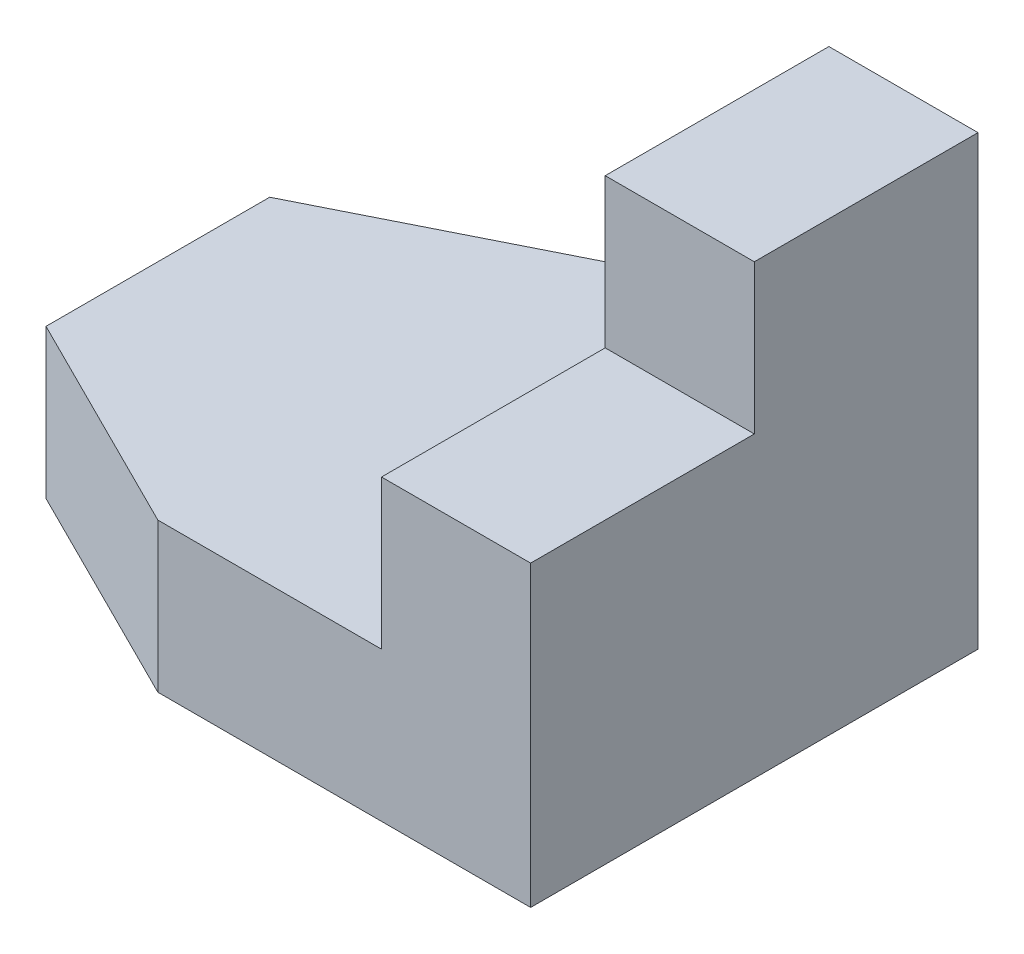
ISO-10303-21;
HEADER;
FILE_DESCRIPTION(('STEP AP214'),'2;1');
FILE_NAME('part.step','',(''),(''),'','','');
FILE_SCHEMA(('AUTOMOTIVE_DESIGN { 1 0 10303 214 1 1 1 1 }'));
ENDSEC;
DATA;
#1=APPLICATION_CONTEXT('core data for automotive mechanical design processes');
#2=APPLICATION_PROTOCOL_DEFINITION('international standard','automotive_design',2000,#1);
#3=PRODUCT_CONTEXT('',#1,'mechanical');
#4=PRODUCT('Part','Part','',(#3));
#5=PRODUCT_RELATED_PRODUCT_CATEGORY('part','',(#4));
#6=PRODUCT_DEFINITION_FORMATION('','',#4);
#7=PRODUCT_DEFINITION_CONTEXT('part definition',#1,'design');
#8=PRODUCT_DEFINITION('design','',#6,#7);
#9=PRODUCT_DEFINITION_SHAPE('','',#8);
#10=(LENGTH_UNIT() NAMED_UNIT(*) SI_UNIT(.MILLI.,.METRE.));
#11=(NAMED_UNIT(*) PLANE_ANGLE_UNIT() SI_UNIT($,.RADIAN.));
#12=(NAMED_UNIT(*) SI_UNIT($,.STERADIAN.) SOLID_ANGLE_UNIT());
#13=UNCERTAINTY_MEASURE_WITH_UNIT(LENGTH_MEASURE(1.E-05),#10,'distance_accuracy_value','');
#14=(GEOMETRIC_REPRESENTATION_CONTEXT(3) GLOBAL_UNCERTAINTY_ASSIGNED_CONTEXT((#13)) GLOBAL_UNIT_ASSIGNED_CONTEXT((#10,
#11,#12)) REPRESENTATION_CONTEXT('',''));
#15=CARTESIAN_POINT('',(0.,0.,0.));
#16=DIRECTION('',(0.,0.,1.));
#17=DIRECTION('',(1.,0.,0.));
#18=AXIS2_PLACEMENT_3D('',#15,#16,#17);
#19=CARTESIAN_POINT('',(-40.,0.,15.));
#20=DIRECTION('',(0.,1.,0.));
#21=DIRECTION('',(0.,0.,1.));
#22=AXIS2_PLACEMENT_3D('',#19,#20,#21);
#23=PLANE('',#22);
#24=DIRECTION('',(0.894427190999916,0.,-0.447213595499958));
#25=VECTOR('',#24,1.);
#26=CARTESIAN_POINT('',(-25.,0.,-15.));
#27=LINE('',#26,#25);
#28=CARTESIAN_POINT('',(-40.,0.,-7.5));
#29=VERTEX_POINT('',#28);
#30=CARTESIAN_POINT('',(-25.,0.,-15.));
#31=VERTEX_POINT('',#30);
#32=EDGE_CURVE('E158',#29,#31,#27,.T.);
#33=ORIENTED_EDGE('',*,*,#32,.T.);
#34=DIRECTION('',(1.,0.,0.));
#35=VECTOR('',#34,1.);
#36=CARTESIAN_POINT('',(-40.,0.,-15.));
#37=LINE('',#36,#35);
#38=CARTESIAN_POINT('',(0.,0.,-15.));
#39=VERTEX_POINT('',#38);
#40=EDGE_CURVE('E156',#31,#39,#37,.T.);
#41=ORIENTED_EDGE('',*,*,#40,.T.);
#42=DIRECTION('',(0.,0.,-1.));
#43=VECTOR('',#42,1.);
#44=CARTESIAN_POINT('',(0.,0.,15.));
#45=LINE('',#44,#43);
#46=CARTESIAN_POINT('',(0.,0.,15.));
#47=VERTEX_POINT('',#46);
#48=EDGE_CURVE('E11',#47,#39,#45,.T.);
#49=ORIENTED_EDGE('',*,*,#48,.F.);
#50=DIRECTION('',(1.,0.,0.));
#51=VECTOR('',#50,1.);
#52=CARTESIAN_POINT('',(-40.,0.,15.));
#53=LINE('',#52,#51);
#54=CARTESIAN_POINT('',(-25.,0.,15.));
#55=VERTEX_POINT('',#54);
#56=EDGE_CURVE('E180',#55,#47,#53,.T.);
#57=ORIENTED_EDGE('',*,*,#56,.F.);
#58=DIRECTION('',(-0.894427190999916,0.,-0.447213595499958));
#59=VECTOR('',#58,1.);
#60=CARTESIAN_POINT('',(-25.,0.,15.));
#61=LINE('',#60,#59);
#62=CARTESIAN_POINT('',(-40.,0.,7.5));
#63=VERTEX_POINT('',#62);
#64=EDGE_CURVE('E68',#55,#63,#61,.T.);
#65=ORIENTED_EDGE('',*,*,#64,.T.);
#66=DIRECTION('',(0.,0.,-1.));
#67=VECTOR('',#66,1.);
#68=CARTESIAN_POINT('',(-40.,0.,15.));
#69=LINE('',#68,#67);
#70=EDGE_CURVE('E194',#63,#29,#69,.T.);
#71=ORIENTED_EDGE('',*,*,#70,.T.);
#72=EDGE_LOOP('',(#33,#41,#49,#57,#65,#71));
#73=FACE_BOUND('',#72,.T.);
#74=ADVANCED_FACE('F45',(#73),#23,.F.);
#75=CARTESIAN_POINT('',(-10.,10.,15.));
#76=DIRECTION('',(0.,-1.,0.));
#77=DIRECTION('',(1.,0.,0.));
#78=AXIS2_PLACEMENT_3D('',#75,#76,#77);
#79=PLANE('',#78);
#80=DIRECTION('',(-0.894427190999916,0.,0.447213595499958));
#81=VECTOR('',#80,1.);
#82=CARTESIAN_POINT('',(-25.,10.,-15.));
#83=LINE('',#82,#81);
#84=CARTESIAN_POINT('',(-25.,10.,-15.));
#85=VERTEX_POINT('',#84);
#86=CARTESIAN_POINT('',(-40.,10.,-7.5));
#87=VERTEX_POINT('',#86);
#88=EDGE_CURVE('E152',#85,#87,#83,.T.);
#89=ORIENTED_EDGE('',*,*,#88,.T.);
#90=DIRECTION('',(0.,0.,-1.));
#91=VECTOR('',#90,1.);
#92=CARTESIAN_POINT('',(-40.,10.,15.));
#93=LINE('',#92,#91);
#94=CARTESIAN_POINT('',(-40.,10.,7.5));
#95=VERTEX_POINT('',#94);
#96=EDGE_CURVE('E214',#95,#87,#93,.T.);
#97=ORIENTED_EDGE('',*,*,#96,.F.);
#98=DIRECTION('',(0.894427190999916,0.,0.447213595499958));
#99=VECTOR('',#98,1.);
#100=CARTESIAN_POINT('',(-25.,10.,15.));
#101=LINE('',#100,#99);
#102=CARTESIAN_POINT('',(-25.,10.,15.));
#103=VERTEX_POINT('',#102);
#104=EDGE_CURVE('E172',#95,#103,#101,.T.);
#105=ORIENTED_EDGE('',*,*,#104,.T.);
#106=DIRECTION('',(-1.,0.,0.));
#107=VECTOR('',#106,1.);
#108=CARTESIAN_POINT('',(-10.,10.,15.));
#109=LINE('',#108,#107);
#110=CARTESIAN_POINT('',(-10.,10.,15.));
#111=VERTEX_POINT('',#110);
#112=EDGE_CURVE('E190',#111,#103,#109,.T.);
#113=ORIENTED_EDGE('',*,*,#112,.F.);
#114=DIRECTION('',(0.,0.,-1.));
#115=VECTOR('',#114,1.);
#116=CARTESIAN_POINT('',(-10.,10.,15.));
#117=LINE('',#116,#115);
#118=CARTESIAN_POINT('',(-10.,10.,-15.));
#119=VERTEX_POINT('',#118);
#120=EDGE_CURVE('E218',#111,#119,#117,.T.);
#121=ORIENTED_EDGE('',*,*,#120,.T.);
#122=DIRECTION('',(-1.,0.,0.));
#123=VECTOR('',#122,1.);
#124=CARTESIAN_POINT('',(-10.,10.,-15.));
#125=LINE('',#124,#123);
#126=EDGE_CURVE('E184',#119,#85,#125,.T.);
#127=ORIENTED_EDGE('',*,*,#126,.T.);
#128=EDGE_LOOP('',(#89,#97,#105,#113,#121,#127));
#129=FACE_BOUND('',#128,.T.);
#130=ADVANCED_FACE('F242',(#129),#79,.F.);
#131=CARTESIAN_POINT('',(-40.,10.,15.));
#132=DIRECTION('',(1.,0.,0.));
#133=DIRECTION('',(0.,0.,-1.));
#134=AXIS2_PLACEMENT_3D('',#131,#132,#133);
#135=PLANE('',#134);
#136=DIRECTION('',(0.,-1.,0.));
#137=VECTOR('',#136,1.);
#138=CARTESIAN_POINT('',(-40.,26.7705098312484,-7.5));
#139=LINE('',#138,#137);
#140=EDGE_CURVE('E157',#87,#29,#139,.T.);
#141=ORIENTED_EDGE('',*,*,#140,.T.);
#142=ORIENTED_EDGE('',*,*,#70,.F.);
#143=DIRECTION('',(0.,-1.,0.));
#144=VECTOR('',#143,1.);
#145=CARTESIAN_POINT('',(-40.,26.7705098312484,7.5));
#146=LINE('',#145,#144);
#147=EDGE_CURVE('E171',#95,#63,#146,.T.);
#148=ORIENTED_EDGE('',*,*,#147,.F.);
#149=ORIENTED_EDGE('',*,*,#96,.T.);
#150=EDGE_LOOP('',(#141,#142,#148,#149));
#151=FACE_BOUND('',#150,.T.);
#152=ADVANCED_FACE('F255',(#151),#135,.F.);
#153=CARTESIAN_POINT('',(0.,0.,15.));
#154=DIRECTION('',(0.,0.,1.));
#155=DIRECTION('',(1.,0.,0.));
#156=AXIS2_PLACEMENT_3D('',#153,#154,#155);
#157=PLANE('',#156);
#158=DIRECTION('',(-1.,0.,0.));
#159=VECTOR('',#158,1.);
#160=CARTESIAN_POINT('',(18.0277563773199,20.,15.));
#161=LINE('',#160,#159);
#162=CARTESIAN_POINT('',(0.,20.,15.));
#163=VERTEX_POINT('',#162);
#164=CARTESIAN_POINT('',(-10.,20.,15.));
#165=VERTEX_POINT('',#164);
#166=EDGE_CURVE('E131',#163,#165,#161,.T.);
#167=ORIENTED_EDGE('',*,*,#166,.T.);
#168=DIRECTION('',(0.,-1.,0.));
#169=VECTOR('',#168,1.);
#170=CARTESIAN_POINT('',(-10.,30.,15.));
#171=LINE('',#170,#169);
#172=EDGE_CURVE('E142',#165,#111,#171,.T.);
#173=ORIENTED_EDGE('',*,*,#172,.T.);
#174=ORIENTED_EDGE('',*,*,#112,.T.);
#175=DIRECTION('',(0.,-1.,0.));
#176=VECTOR('',#175,1.);
#177=CARTESIAN_POINT('',(-25.,26.7705098312484,15.));
#178=LINE('',#177,#176);
#179=EDGE_CURVE('E168',#103,#55,#178,.T.);
#180=ORIENTED_EDGE('',*,*,#179,.T.);
#181=ORIENTED_EDGE('',*,*,#56,.T.);
#182=DIRECTION('',(0.,1.,0.));
#183=VECTOR('',#182,1.);
#184=CARTESIAN_POINT('',(0.,0.,15.));
#185=LINE('',#184,#183);
#186=EDGE_CURVE('E183',#47,#163,#185,.T.);
#187=ORIENTED_EDGE('',*,*,#186,.T.);
#188=EDGE_LOOP('',(#167,#173,#174,#180,#181,#187));
#189=FACE_BOUND('',#188,.T.);
#190=ADVANCED_FACE('F245',(#189),#157,.T.);
#191=CARTESIAN_POINT('',(0.,0.,-15.));
#192=DIRECTION('',(0.,0.,1.));
#193=DIRECTION('',(1.,0.,0.));
#194=AXIS2_PLACEMENT_3D('',#191,#192,#193);
#195=PLANE('',#194);
#196=DIRECTION('',(0.,-1.,0.));
#197=VECTOR('',#196,1.);
#198=CARTESIAN_POINT('',(-25.,26.7705098312484,-15.));
#199=LINE('',#198,#197);
#200=EDGE_CURVE('E162',#85,#31,#199,.T.);
#201=ORIENTED_EDGE('',*,*,#200,.F.);
#202=ORIENTED_EDGE('',*,*,#126,.F.);
#203=DIRECTION('',(0.,-1.,0.));
#204=VECTOR('',#203,1.);
#205=CARTESIAN_POINT('',(-10.,30.,-15.));
#206=LINE('',#205,#204);
#207=CARTESIAN_POINT('',(-10.,30.,-15.));
#208=VERTEX_POINT('',#207);
#209=EDGE_CURVE('E205',#208,#119,#206,.T.);
#210=ORIENTED_EDGE('',*,*,#209,.F.);
#211=DIRECTION('',(-1.,0.,0.));
#212=VECTOR('',#211,1.);
#213=CARTESIAN_POINT('',(0.,30.,-15.));
#214=LINE('',#213,#212);
#215=CARTESIAN_POINT('',(0.,30.,-15.));
#216=VERTEX_POINT('',#215);
#217=EDGE_CURVE('E201',#216,#208,#214,.T.);
#218=ORIENTED_EDGE('',*,*,#217,.F.);
#219=DIRECTION('',(0.,1.,0.));
#220=VECTOR('',#219,1.);
#221=CARTESIAN_POINT('',(0.,0.,-15.));
#222=LINE('',#221,#220);
#223=EDGE_CURVE('E197',#39,#216,#222,.T.);
#224=ORIENTED_EDGE('',*,*,#223,.F.);
#225=ORIENTED_EDGE('',*,*,#40,.F.);
#226=EDGE_LOOP('',(#201,#202,#210,#218,#224,#225));
#227=FACE_BOUND('',#226,.T.);
#228=ADVANCED_FACE('F238',(#227),#195,.F.);
#229=CARTESIAN_POINT('',(0.,0.,15.));
#230=DIRECTION('',(-1.,0.,0.));
#231=DIRECTION('',(0.,0.,1.));
#232=AXIS2_PLACEMENT_3D('',#229,#230,#231);
#233=PLANE('',#232);
#234=DIRECTION('',(0.,1.,0.));
#235=VECTOR('',#234,1.);
#236=CARTESIAN_POINT('',(0.,30.,0.));
#237=LINE('',#236,#235);
#238=CARTESIAN_POINT('',(0.,20.,0.));
#239=VERTEX_POINT('',#238);
#240=CARTESIAN_POINT('',(0.,30.,0.));
#241=VERTEX_POINT('',#240);
#242=EDGE_CURVE('E150',#239,#241,#237,.T.);
#243=ORIENTED_EDGE('',*,*,#242,.F.);
#244=DIRECTION('',(0.,0.,-1.));
#245=VECTOR('',#244,1.);
#246=CARTESIAN_POINT('',(0.,20.,15.));
#247=LINE('',#246,#245);
#248=EDGE_CURVE('E128',#163,#239,#247,.T.);
#249=ORIENTED_EDGE('',*,*,#248,.F.);
#250=ORIENTED_EDGE('',*,*,#186,.F.);
#251=ORIENTED_EDGE('',*,*,#48,.T.);
#252=ORIENTED_EDGE('',*,*,#223,.T.);
#253=DIRECTION('',(0.,0.,-1.));
#254=VECTOR('',#253,1.);
#255=CARTESIAN_POINT('',(0.,30.,15.));
#256=LINE('',#255,#254);
#257=EDGE_CURVE('E53',#241,#216,#256,.T.);
#258=ORIENTED_EDGE('',*,*,#257,.F.);
#259=EDGE_LOOP('',(#243,#249,#250,#251,#252,#258));
#260=FACE_BOUND('',#259,.T.);
#261=ADVANCED_FACE('F232',(#260),#233,.F.);
#262=CARTESIAN_POINT('',(0.,30.,15.));
#263=DIRECTION('',(0.,-1.,0.));
#264=DIRECTION('',(0.,0.,-1.));
#265=AXIS2_PLACEMENT_3D('',#262,#263,#264);
#266=PLANE('',#265);
#267=DIRECTION('',(0.,0.,-1.));
#268=VECTOR('',#267,1.);
#269=CARTESIAN_POINT('',(-10.,30.,15.));
#270=LINE('',#269,#268);
#271=CARTESIAN_POINT('',(-10.,30.,0.));
#272=VERTEX_POINT('',#271);
#273=EDGE_CURVE('E222',#272,#208,#270,.T.);
#274=ORIENTED_EDGE('',*,*,#273,.F.);
#275=DIRECTION('',(-1.,0.,0.));
#276=VECTOR('',#275,1.);
#277=CARTESIAN_POINT('',(18.0277563773199,30.,0.));
#278=LINE('',#277,#276);
#279=EDGE_CURVE('E60',#241,#272,#278,.T.);
#280=ORIENTED_EDGE('',*,*,#279,.F.);
#281=ORIENTED_EDGE('',*,*,#257,.T.);
#282=ORIENTED_EDGE('',*,*,#217,.T.);
#283=EDGE_LOOP('',(#274,#280,#281,#282));
#284=FACE_BOUND('',#283,.T.);
#285=ADVANCED_FACE('F227',(#284),#266,.F.);
#286=CARTESIAN_POINT('',(-10.,30.,15.));
#287=DIRECTION('',(1.,0.,0.));
#288=DIRECTION('',(0.,1.,0.));
#289=AXIS2_PLACEMENT_3D('',#286,#287,#288);
#290=PLANE('',#289);
#291=ORIENTED_EDGE('',*,*,#172,.F.);
#292=DIRECTION('',(0.,0.,1.));
#293=VECTOR('',#292,1.);
#294=CARTESIAN_POINT('',(-10.,20.,15.));
#295=LINE('',#294,#293);
#296=CARTESIAN_POINT('',(-10.,20.,0.));
#297=VERTEX_POINT('',#296);
#298=EDGE_CURVE('E125',#297,#165,#295,.T.);
#299=ORIENTED_EDGE('',*,*,#298,.F.);
#300=DIRECTION('',(0.,-1.,0.));
#301=VECTOR('',#300,1.);
#302=CARTESIAN_POINT('',(-10.,30.,0.));
#303=LINE('',#302,#301);
#304=EDGE_CURVE('E133',#272,#297,#303,.T.);
#305=ORIENTED_EDGE('',*,*,#304,.F.);
#306=ORIENTED_EDGE('',*,*,#273,.T.);
#307=ORIENTED_EDGE('',*,*,#209,.T.);
#308=ORIENTED_EDGE('',*,*,#120,.F.);
#309=EDGE_LOOP('',(#291,#299,#305,#306,#307,#308));
#310=FACE_BOUND('',#309,.T.);
#311=ADVANCED_FACE('F140',(#310),#290,.F.);
#312=CARTESIAN_POINT('',(-25.,26.7705098312484,-15.));
#313=DIRECTION('',(-0.447213595499958,0.,-0.894427190999916));
#314=DIRECTION('',(-0.894427190999916,0.,0.447213595499958));
#315=AXIS2_PLACEMENT_3D('',#312,#313,#314);
#316=PLANE('',#315);
#317=ORIENTED_EDGE('',*,*,#200,.T.);
#318=ORIENTED_EDGE('',*,*,#32,.F.);
#319=ORIENTED_EDGE('',*,*,#140,.F.);
#320=ORIENTED_EDGE('',*,*,#88,.F.);
#321=EDGE_LOOP('',(#317,#318,#319,#320));
#322=FACE_BOUND('',#321,.T.);
#323=ADVANCED_FACE('F252',(#322),#316,.T.);
#324=CARTESIAN_POINT('',(-25.,26.7705098312484,15.));
#325=DIRECTION('',(-0.447213595499958,0.,0.894427190999916));
#326=DIRECTION('',(0.894427190999916,0.,0.447213595499958));
#327=AXIS2_PLACEMENT_3D('',#324,#325,#326);
#328=PLANE('',#327);
#329=ORIENTED_EDGE('',*,*,#147,.T.);
#330=ORIENTED_EDGE('',*,*,#64,.F.);
#331=ORIENTED_EDGE('',*,*,#179,.F.);
#332=ORIENTED_EDGE('',*,*,#104,.F.);
#333=EDGE_LOOP('',(#329,#330,#331,#332));
#334=FACE_BOUND('',#333,.T.);
#335=ADVANCED_FACE('F257',(#334),#328,.T.);
#336=CARTESIAN_POINT('',(18.0277563773199,20.,15.));
#337=DIRECTION('',(0.,-1.,0.));
#338=DIRECTION('',(1.,0.,0.));
#339=AXIS2_PLACEMENT_3D('',#336,#337,#338);
#340=PLANE('',#339);
#341=ORIENTED_EDGE('',*,*,#248,.T.);
#342=DIRECTION('',(-1.,0.,0.));
#343=VECTOR('',#342,1.);
#344=CARTESIAN_POINT('',(18.0277563773199,20.,0.));
#345=LINE('',#344,#343);
#346=EDGE_CURVE('E122',#239,#297,#345,.T.);
#347=ORIENTED_EDGE('',*,*,#346,.T.);
#348=ORIENTED_EDGE('',*,*,#298,.T.);
#349=ORIENTED_EDGE('',*,*,#166,.F.);
#350=EDGE_LOOP('',(#341,#347,#348,#349));
#351=FACE_BOUND('',#350,.T.);
#352=ADVANCED_FACE('F123',(#351),#340,.F.);
#353=CARTESIAN_POINT('',(18.0277563773199,30.,0.));
#354=DIRECTION('',(0.,0.,-1.));
#355=DIRECTION('',(0.,1.,0.));
#356=AXIS2_PLACEMENT_3D('',#353,#354,#355);
#357=PLANE('',#356);
#358=ORIENTED_EDGE('',*,*,#242,.T.);
#359=ORIENTED_EDGE('',*,*,#279,.T.);
#360=ORIENTED_EDGE('',*,*,#304,.T.);
#361=ORIENTED_EDGE('',*,*,#346,.F.);
#362=EDGE_LOOP('',(#358,#359,#360,#361));
#363=FACE_BOUND('',#362,.T.);
#364=ADVANCED_FACE('F134',(#363),#357,.F.);
#365=CLOSED_SHELL('',(#74,#130,#152,#190,#228,#261,#285,#311,#323,#335,#352,#364));
#366=MANIFOLD_SOLID_BREP('B2',#365);
#367=ADVANCED_BREP_SHAPE_REPRESENTATION('',(#18,#366),#14);
#368=SHAPE_DEFINITION_REPRESENTATION(#9,#367);
ENDSEC;
END-ISO-10303-21;
